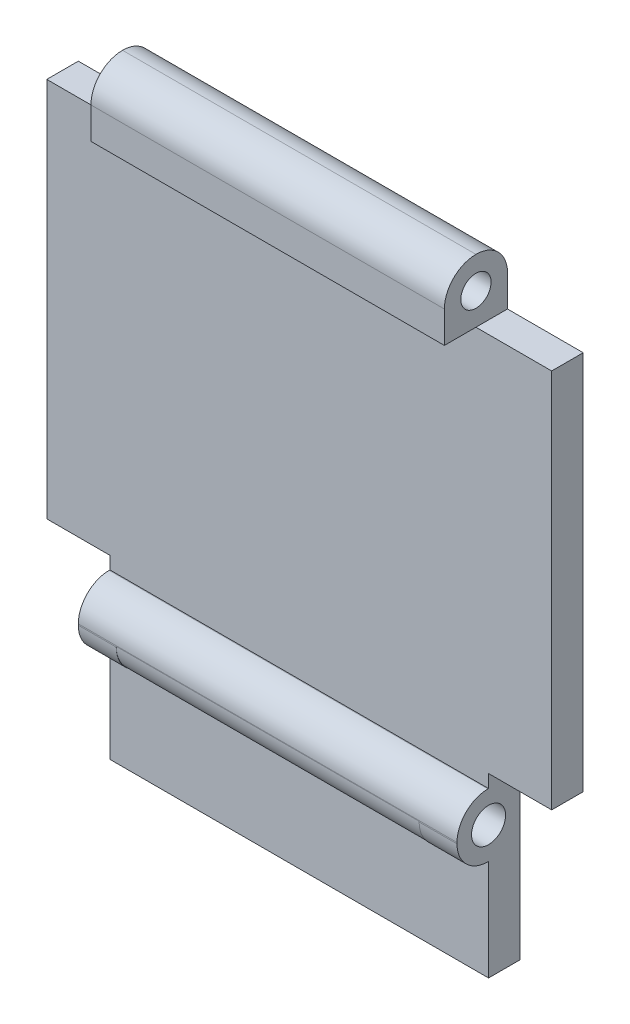
ISO-10303-21;
HEADER;
FILE_DESCRIPTION(('STEP AP214'),'2;1');
FILE_NAME('part.step','',(''),(''),'','','');
FILE_SCHEMA(('AUTOMOTIVE_DESIGN { 1 0 10303 214 1 1 1 1 }'));
ENDSEC;
DATA;
#1=APPLICATION_CONTEXT('core data for automotive mechanical design processes');
#2=APPLICATION_PROTOCOL_DEFINITION('international standard','automotive_design',2000,#1);
#3=PRODUCT_CONTEXT('',#1,'mechanical');
#4=PRODUCT('Part','Part','',(#3));
#5=PRODUCT_RELATED_PRODUCT_CATEGORY('part','',(#4));
#6=PRODUCT_DEFINITION_FORMATION('','',#4);
#7=PRODUCT_DEFINITION_CONTEXT('part definition',#1,'design');
#8=PRODUCT_DEFINITION('design','',#6,#7);
#9=PRODUCT_DEFINITION_SHAPE('','',#8);
#10=(LENGTH_UNIT() NAMED_UNIT(*) SI_UNIT(.MILLI.,.METRE.));
#11=(NAMED_UNIT(*) PLANE_ANGLE_UNIT() SI_UNIT($,.RADIAN.));
#12=(NAMED_UNIT(*) SI_UNIT($,.STERADIAN.) SOLID_ANGLE_UNIT());
#13=UNCERTAINTY_MEASURE_WITH_UNIT(LENGTH_MEASURE(1.E-05),#10,'distance_accuracy_value','');
#14=(GEOMETRIC_REPRESENTATION_CONTEXT(3) GLOBAL_UNCERTAINTY_ASSIGNED_CONTEXT((#13)) GLOBAL_UNIT_ASSIGNED_CONTEXT((#10,
#11,#12)) REPRESENTATION_CONTEXT('',''));
#15=CARTESIAN_POINT('',(0.,0.,0.));
#16=DIRECTION('',(0.,0.,1.));
#17=DIRECTION('',(1.,0.,0.));
#18=AXIS2_PLACEMENT_3D('',#15,#16,#17);
#19=CARTESIAN_POINT('',(12.,-10.5439596254959,2.5));
#20=DIRECTION('',(0.,1.,0.));
#21=DIRECTION('',(0.,0.,1.));
#22=AXIS2_PLACEMENT_3D('',#19,#20,#21);
#23=PLANE('',#22);
#24=DIRECTION('',(0.,0.,1.));
#25=VECTOR('',#24,1.);
#26=CARTESIAN_POINT('',(15.,-10.5439596254959,2.5));
#27=LINE('',#26,#25);
#28=CARTESIAN_POINT('',(15.,-10.5439596254959,0.));
#29=VERTEX_POINT('',#28);
#30=CARTESIAN_POINT('',(15.,-10.5439596254959,2.5));
#31=VERTEX_POINT('',#30);
#32=EDGE_CURVE('E276',#29,#31,#27,.T.);
#33=ORIENTED_EDGE('',*,*,#32,.F.);
#34=DIRECTION('',(-1.,0.,0.));
#35=VECTOR('',#34,1.);
#36=CARTESIAN_POINT('',(0.,-10.5439596254959,0.));
#37=LINE('',#36,#35);
#38=CARTESIAN_POINT('',(20.,-10.5439596254959,0.));
#39=VERTEX_POINT('',#38);
#40=EDGE_CURVE('E331',#39,#29,#37,.T.);
#41=ORIENTED_EDGE('',*,*,#40,.F.);
#42=DIRECTION('',(0.,0.,1.));
#43=VECTOR('',#42,1.);
#44=CARTESIAN_POINT('',(20.,-10.5439596254959,2.5));
#45=LINE('',#44,#43);
#46=CARTESIAN_POINT('',(20.,-10.5439596254959,2.5));
#47=VERTEX_POINT('',#46);
#48=EDGE_CURVE('E326',#39,#47,#45,.T.);
#49=ORIENTED_EDGE('',*,*,#48,.T.);
#50=DIRECTION('',(1.,0.,0.));
#51=VECTOR('',#50,1.);
#52=CARTESIAN_POINT('',(12.,-10.5439596254959,2.5));
#53=LINE('',#52,#51);
#54=EDGE_CURVE('E329',#31,#47,#53,.T.);
#55=ORIENTED_EDGE('',*,*,#54,.F.);
#56=EDGE_LOOP('',(#33,#41,#49,#55));
#57=FACE_BOUND('',#56,.T.);
#58=ADVANCED_FACE('F36',(#57),#23,.F.);
#59=CARTESIAN_POINT('',(0.,0.,2.5));
#60=DIRECTION('',(0.,0.,1.));
#61=DIRECTION('',(1.,0.,0.));
#62=AXIS2_PLACEMENT_3D('',#59,#60,#61);
#63=PLANE('',#62);
#64=DIRECTION('',(1.,0.,0.));
#65=VECTOR('',#64,1.);
#66=CARTESIAN_POINT('',(20.,-24.575,2.5));
#67=LINE('',#66,#65);
#68=CARTESIAN_POINT('',(-15.,-24.575,2.5));
#69=VERTEX_POINT('',#68);
#70=CARTESIAN_POINT('',(15.,-24.575,2.5));
#71=VERTEX_POINT('',#70);
#72=EDGE_CURVE('E235',#69,#71,#67,.T.);
#73=ORIENTED_EDGE('',*,*,#72,.T.);
#74=DIRECTION('',(0.,-1.,0.));
#75=VECTOR('',#74,1.);
#76=CARTESIAN_POINT('',(15.,-24.575,2.5));
#77=LINE('',#76,#75);
#78=CARTESIAN_POINT('',(15.,-16.575,2.5));
#79=VERTEX_POINT('',#78);
#80=EDGE_CURVE('E290',#79,#71,#77,.T.);
#81=ORIENTED_EDGE('',*,*,#80,.F.);
#82=DIRECTION('',(-1.,0.,0.));
#83=VECTOR('',#82,1.);
#84=CARTESIAN_POINT('',(15.,-16.575,2.5));
#85=LINE('',#84,#83);
#86=CARTESIAN_POINT('',(12.,-16.575,2.5));
#87=VERTEX_POINT('',#86);
#88=EDGE_CURVE('E295',#79,#87,#85,.T.);
#89=ORIENTED_EDGE('',*,*,#88,.T.);
#90=DIRECTION('',(1.,0.,0.));
#91=VECTOR('',#90,1.);
#92=CARTESIAN_POINT('',(0.,-16.575,2.5));
#93=LINE('',#92,#91);
#94=CARTESIAN_POINT('',(-12.,-16.575,2.5));
#95=VERTEX_POINT('',#94);
#96=EDGE_CURVE('E316',#95,#87,#93,.T.);
#97=ORIENTED_EDGE('',*,*,#96,.F.);
#98=DIRECTION('',(1.,0.,0.));
#99=VECTOR('',#98,1.);
#100=CARTESIAN_POINT('',(-15.,-16.575,2.5));
#101=LINE('',#100,#99);
#102=CARTESIAN_POINT('',(-15.,-16.575,2.5));
#103=VERTEX_POINT('',#102);
#104=EDGE_CURVE('E268',#103,#95,#101,.T.);
#105=ORIENTED_EDGE('',*,*,#104,.F.);
#106=DIRECTION('',(0.,1.,0.));
#107=VECTOR('',#106,1.);
#108=CARTESIAN_POINT('',(-15.,-24.575,2.5));
#109=LINE('',#108,#107);
#110=EDGE_CURVE('E238',#69,#103,#109,.T.);
#111=ORIENTED_EDGE('',*,*,#110,.F.);
#112=EDGE_LOOP('',(#73,#81,#89,#97,#105,#111));
#113=FACE_BOUND('',#112,.T.);
#114=ADVANCED_FACE('F460',(#113),#63,.T.);
#115=CARTESIAN_POINT('',(20.,-24.575,5.));
#116=DIRECTION('',(-1.,0.,0.));
#117=DIRECTION('',(0.,0.,1.));
#118=AXIS2_PLACEMENT_3D('',#115,#116,#117);
#119=PLANE('',#118);
#120=DIRECTION('',(0.,1.,0.));
#121=VECTOR('',#120,1.);
#122=CARTESIAN_POINT('',(20.,19.575,2.5));
#123=LINE('',#122,#121);
#124=CARTESIAN_POINT('',(20.,19.575,2.5));
#125=VERTEX_POINT('',#124);
#126=EDGE_CURVE('E350',#47,#125,#123,.T.);
#127=ORIENTED_EDGE('',*,*,#126,.F.);
#128=ORIENTED_EDGE('',*,*,#48,.F.);
#129=DIRECTION('',(0.,1.,0.));
#130=VECTOR('',#129,1.);
#131=CARTESIAN_POINT('',(20.,-24.575,0.));
#132=LINE('',#131,#130);
#133=CARTESIAN_POINT('',(20.,19.575,0.));
#134=VERTEX_POINT('',#133);
#135=EDGE_CURVE('E229',#39,#134,#132,.T.);
#136=ORIENTED_EDGE('',*,*,#135,.T.);
#137=DIRECTION('',(0.,0.,-1.));
#138=VECTOR('',#137,1.);
#139=CARTESIAN_POINT('',(20.,19.575,5.));
#140=LINE('',#139,#138);
#141=EDGE_CURVE('E379',#125,#134,#140,.T.);
#142=ORIENTED_EDGE('',*,*,#141,.F.);
#143=EDGE_LOOP('',(#127,#128,#136,#142));
#144=FACE_BOUND('',#143,.T.);
#145=ADVANCED_FACE('F542',(#144),#119,.F.);
#146=CARTESIAN_POINT('',(20.,-24.575,5.));
#147=DIRECTION('',(0.,1.,0.));
#148=DIRECTION('',(-1.,0.,0.));
#149=AXIS2_PLACEMENT_3D('',#146,#147,#148);
#150=PLANE('',#149);
#151=DIRECTION('',(1.,0.,0.));
#152=VECTOR('',#151,1.);
#153=CARTESIAN_POINT('',(20.,-24.575,0.));
#154=LINE('',#153,#152);
#155=CARTESIAN_POINT('',(-15.,-24.575,0.));
#156=VERTEX_POINT('',#155);
#157=CARTESIAN_POINT('',(15.,-24.575,0.));
#158=VERTEX_POINT('',#157);
#159=EDGE_CURVE('E218',#156,#158,#154,.T.);
#160=ORIENTED_EDGE('',*,*,#159,.T.);
#161=DIRECTION('',(0.,0.,-1.));
#162=VECTOR('',#161,1.);
#163=CARTESIAN_POINT('',(15.,-24.575,0.));
#164=LINE('',#163,#162);
#165=EDGE_CURVE('E293',#71,#158,#164,.T.);
#166=ORIENTED_EDGE('',*,*,#165,.F.);
#167=ORIENTED_EDGE('',*,*,#72,.F.);
#168=DIRECTION('',(0.,0.,1.));
#169=VECTOR('',#168,1.);
#170=CARTESIAN_POINT('',(-15.,-24.575,0.));
#171=LINE('',#170,#169);
#172=EDGE_CURVE('E233',#156,#69,#171,.T.);
#173=ORIENTED_EDGE('',*,*,#172,.F.);
#174=EDGE_LOOP('',(#160,#166,#167,#173));
#175=FACE_BOUND('',#174,.T.);
#176=ADVANCED_FACE('F234',(#175),#150,.F.);
#177=CARTESIAN_POINT('',(20.,19.575,5.));
#178=DIRECTION('',(0.,1.,0.));
#179=DIRECTION('',(0.,0.,1.));
#180=AXIS2_PLACEMENT_3D('',#177,#178,#179);
#181=PLANE('',#180);
#182=DIRECTION('',(0.,0.,-1.));
#183=VECTOR('',#182,1.);
#184=CARTESIAN_POINT('',(14.,19.575,5.));
#185=LINE('',#184,#183);
#186=CARTESIAN_POINT('',(14.,19.575,2.5));
#187=VERTEX_POINT('',#186);
#188=CARTESIAN_POINT('',(14.,19.575,0.));
#189=VERTEX_POINT('',#188);
#190=EDGE_CURVE('E387',#187,#189,#185,.T.);
#191=ORIENTED_EDGE('',*,*,#190,.F.);
#192=DIRECTION('',(-1.,0.,0.));
#193=VECTOR('',#192,1.);
#194=CARTESIAN_POINT('',(20.,19.575,2.5));
#195=LINE('',#194,#193);
#196=EDGE_CURVE('E342',#125,#187,#195,.T.);
#197=ORIENTED_EDGE('',*,*,#196,.F.);
#198=ORIENTED_EDGE('',*,*,#141,.T.);
#199=DIRECTION('',(1.,0.,0.));
#200=VECTOR('',#199,1.);
#201=CARTESIAN_POINT('',(20.,19.575,0.));
#202=LINE('',#201,#200);
#203=EDGE_CURVE('E380',#189,#134,#202,.T.);
#204=ORIENTED_EDGE('',*,*,#203,.F.);
#205=EDGE_LOOP('',(#191,#197,#198,#204));
#206=FACE_BOUND('',#205,.T.);
#207=ADVANCED_FACE('F538',(#206),#181,.T.);
#208=CARTESIAN_POINT('',(-20.,-24.575,5.));
#209=DIRECTION('',(1.,0.,0.));
#210=DIRECTION('',(0.,0.,-1.));
#211=AXIS2_PLACEMENT_3D('',#208,#209,#210);
#212=PLANE('',#211);
#213=DIRECTION('',(0.,-1.,0.));
#214=VECTOR('',#213,1.);
#215=CARTESIAN_POINT('',(-20.,-24.575,0.));
#216=LINE('',#215,#214);
#217=CARTESIAN_POINT('',(-20.,19.5799216405794,0.));
#218=VERTEX_POINT('',#217);
#219=CARTESIAN_POINT('',(-20.,-10.575,0.));
#220=VERTEX_POINT('',#219);
#221=EDGE_CURVE('E230',#218,#220,#216,.T.);
#222=ORIENTED_EDGE('',*,*,#221,.T.);
#223=DIRECTION('',(0.,0.,-1.));
#224=VECTOR('',#223,1.);
#225=CARTESIAN_POINT('',(-20.,-10.575,2.49999999999999));
#226=LINE('',#225,#224);
#227=CARTESIAN_POINT('',(-20.,-10.575,2.49999999999999));
#228=VERTEX_POINT('',#227);
#229=EDGE_CURVE('E319',#228,#220,#226,.T.);
#230=ORIENTED_EDGE('',*,*,#229,.F.);
#231=DIRECTION('',(0.,-1.,0.));
#232=VECTOR('',#231,1.);
#233=CARTESIAN_POINT('',(-19.9999995124092,19.575,2.5));
#234=LINE('',#233,#232);
#235=CARTESIAN_POINT('',(-20.,19.5799216405794,2.5));
#236=VERTEX_POINT('',#235);
#237=EDGE_CURVE('E345',#236,#228,#234,.T.);
#238=ORIENTED_EDGE('',*,*,#237,.F.);
#239=DIRECTION('',(0.,0.,-1.));
#240=VECTOR('',#239,1.);
#241=CARTESIAN_POINT('',(-20.,19.5799216405794,5.));
#242=LINE('',#241,#240);
#243=EDGE_CURVE('E374',#236,#218,#242,.T.);
#244=ORIENTED_EDGE('',*,*,#243,.T.);
#245=EDGE_LOOP('',(#222,#230,#238,#244));
#246=FACE_BOUND('',#245,.T.);
#247=ADVANCED_FACE('F501',(#246),#212,.F.);
#248=CARTESIAN_POINT('',(0.,0.,5.));
#249=DIRECTION('',(0.,0.,1.));
#250=DIRECTION('',(1.,0.,0.));
#251=AXIS2_PLACEMENT_3D('',#248,#249,#250);
#252=PLANE('',#251);
#253=DIRECTION('',(0.,1.,0.));
#254=VECTOR('',#253,1.);
#255=CARTESIAN_POINT('',(-14.,24.575,5.));
#256=LINE('',#255,#254);
#257=CARTESIAN_POINT('',(-14.,19.575,5.));
#258=VERTEX_POINT('',#257);
#259=CARTESIAN_POINT('',(-14.,22.075,5.));
#260=VERTEX_POINT('',#259);
#261=EDGE_CURVE('E362',#258,#260,#256,.T.);
#262=ORIENTED_EDGE('',*,*,#261,.F.);
#263=DIRECTION('',(-1.,0.,0.));
#264=VECTOR('',#263,1.);
#265=CARTESIAN_POINT('',(20.,19.575,5.));
#266=LINE('',#265,#264);
#267=CARTESIAN_POINT('',(14.,19.575,5.));
#268=VERTEX_POINT('',#267);
#269=EDGE_CURVE('E341',#268,#258,#266,.T.);
#270=ORIENTED_EDGE('',*,*,#269,.F.);
#271=DIRECTION('',(0.,-1.,0.));
#272=VECTOR('',#271,1.);
#273=CARTESIAN_POINT('',(14.,24.575,5.));
#274=LINE('',#273,#272);
#275=CARTESIAN_POINT('',(14.,22.075,5.));
#276=VERTEX_POINT('',#275);
#277=EDGE_CURVE('E376',#276,#268,#274,.T.);
#278=ORIENTED_EDGE('',*,*,#277,.F.);
#279=DIRECTION('',(-1.,0.,0.));
#280=VECTOR('',#279,1.);
#281=CARTESIAN_POINT('',(-14.,22.075,5.));
#282=LINE('',#281,#280);
#283=EDGE_CURVE('E393',#276,#260,#282,.T.);
#284=ORIENTED_EDGE('',*,*,#283,.T.);
#285=EDGE_LOOP('',(#262,#270,#278,#284));
#286=FACE_BOUND('',#285,.T.);
#287=ADVANCED_FACE('F528',(#286),#252,.T.);
#288=CARTESIAN_POINT('',(0.,0.,0.));
#289=DIRECTION('',(0.,0.,1.));
#290=DIRECTION('',(1.,0.,0.));
#291=AXIS2_PLACEMENT_3D('',#288,#289,#290);
#292=PLANE('',#291);
#293=DIRECTION('',(0.,-1.,0.));
#294=VECTOR('',#293,1.);
#295=CARTESIAN_POINT('',(-15.,-10.575,0.));
#296=LINE('',#295,#294);
#297=CARTESIAN_POINT('',(-15.,-10.575,0.));
#298=VERTEX_POINT('',#297);
#299=EDGE_CURVE('E222',#298,#156,#296,.T.);
#300=ORIENTED_EDGE('',*,*,#299,.F.);
#301=DIRECTION('',(-1.,0.,0.));
#302=VECTOR('',#301,1.);
#303=CARTESIAN_POINT('',(0.,-10.575,0.));
#304=LINE('',#303,#302);
#305=EDGE_CURVE('E324',#298,#220,#304,.T.);
#306=ORIENTED_EDGE('',*,*,#305,.T.);
#307=ORIENTED_EDGE('',*,*,#221,.F.);
#308=DIRECTION('',(1.,0.,0.));
#309=VECTOR('',#308,1.);
#310=CARTESIAN_POINT('',(-20.,19.5799216405794,0.));
#311=LINE('',#310,#309);
#312=CARTESIAN_POINT('',(-14.,19.5799216405794,0.));
#313=VERTEX_POINT('',#312);
#314=EDGE_CURVE('E367',#218,#313,#311,.T.);
#315=ORIENTED_EDGE('',*,*,#314,.T.);
#316=DIRECTION('',(0.,1.,0.));
#317=VECTOR('',#316,1.);
#318=CARTESIAN_POINT('',(-14.,24.575,0.));
#319=LINE('',#318,#317);
#320=CARTESIAN_POINT('',(-14.,22.075,0.));
#321=VERTEX_POINT('',#320);
#322=EDGE_CURVE('E366',#313,#321,#319,.T.);
#323=ORIENTED_EDGE('',*,*,#322,.T.);
#324=DIRECTION('',(-1.,0.,0.));
#325=VECTOR('',#324,1.);
#326=CARTESIAN_POINT('',(0.,22.075,0.));
#327=LINE('',#326,#325);
#328=CARTESIAN_POINT('',(14.,22.075,0.));
#329=VERTEX_POINT('',#328);
#330=EDGE_CURVE('E404',#321,#329,#327,.F.);
#331=ORIENTED_EDGE('',*,*,#330,.T.);
#332=DIRECTION('',(0.,-1.,0.));
#333=VECTOR('',#332,1.);
#334=CARTESIAN_POINT('',(14.,24.575,0.));
#335=LINE('',#334,#333);
#336=EDGE_CURVE('E361',#329,#189,#335,.T.);
#337=ORIENTED_EDGE('',*,*,#336,.T.);
#338=ORIENTED_EDGE('',*,*,#203,.T.);
#339=ORIENTED_EDGE('',*,*,#135,.F.);
#340=ORIENTED_EDGE('',*,*,#40,.T.);
#341=DIRECTION('',(0.,1.,0.));
#342=VECTOR('',#341,1.);
#343=CARTESIAN_POINT('',(15.,-10.5439596254959,0.));
#344=LINE('',#343,#342);
#345=EDGE_CURVE('E225',#158,#29,#344,.T.);
#346=ORIENTED_EDGE('',*,*,#345,.F.);
#347=ORIENTED_EDGE('',*,*,#159,.F.);
#348=EDGE_LOOP('',(#300,#306,#307,#315,#323,#331,#337,#338,#339,#340,#346,#347));
#349=FACE_BOUND('',#348,.T.);
#350=ADVANCED_FACE('F220',(#349),#292,.F.);
#351=CARTESIAN_POINT('',(14.,24.575,5.));
#352=DIRECTION('',(1.,0.,0.));
#353=DIRECTION('',(0.,1.,0.));
#354=AXIS2_PLACEMENT_3D('',#351,#352,#353);
#355=PLANE('',#354);
#356=CARTESIAN_POINT('',(14.,22.075,2.5));
#357=DIRECTION('',(1.,0.,0.));
#358=DIRECTION('',(0.,1.,0.));
#359=AXIS2_PLACEMENT_3D('',#356,#357,#358);
#360=CIRCLE('',#359,1.2);
#361=CARTESIAN_POINT('',(14.,23.275,2.5));
#362=VERTEX_POINT('',#361);
#363=EDGE_CURVE('E358',#362,#362,#360,.T.);
#364=ORIENTED_EDGE('',*,*,#363,.F.);
#365=EDGE_LOOP('',(#364));
#366=FACE_BOUND('',#365,.T.);
#367=CARTESIAN_POINT('',(14.,22.075,2.5));
#368=DIRECTION('',(1.,0.,0.));
#369=DIRECTION('',(0.,1.,0.));
#370=AXIS2_PLACEMENT_3D('',#367,#368,#369);
#371=CIRCLE('',#370,2.5);
#372=CARTESIAN_POINT('',(14.,24.575,2.5));
#373=VERTEX_POINT('',#372);
#374=EDGE_CURVE('E400',#329,#373,#371,.T.);
#375=ORIENTED_EDGE('',*,*,#374,.T.);
#376=CARTESIAN_POINT('',(14.,22.075,2.5));
#377=DIRECTION('',(1.,0.,0.));
#378=DIRECTION('',(0.,1.,0.));
#379=AXIS2_PLACEMENT_3D('',#376,#377,#378);
#380=CIRCLE('',#379,2.5);
#381=EDGE_CURVE('E402',#373,#276,#380,.T.);
#382=ORIENTED_EDGE('',*,*,#381,.T.);
#383=ORIENTED_EDGE('',*,*,#277,.T.);
#384=EDGE_CURVE('E370',#268,#187,#185,.T.);
#385=ORIENTED_EDGE('',*,*,#384,.T.);
#386=ORIENTED_EDGE('',*,*,#190,.T.);
#387=ORIENTED_EDGE('',*,*,#336,.F.);
#388=EDGE_LOOP('',(#375,#382,#383,#385,#386,#387));
#389=FACE_BOUND('',#388,.T.);
#390=ADVANCED_FACE('F524',(#366,#389),#355,.T.);
#391=CARTESIAN_POINT('',(-20.,19.5799216405794,5.));
#392=DIRECTION('',(0.,1.,0.));
#393=DIRECTION('',(0.,0.,1.));
#394=AXIS2_PLACEMENT_3D('',#391,#392,#393);
#395=PLANE('',#394);
#396=DIRECTION('',(-1.,0.,0.));
#397=VECTOR('',#396,1.);
#398=CARTESIAN_POINT('',(-20.,19.5799216405794,2.5));
#399=LINE('',#398,#397);
#400=CARTESIAN_POINT('',(-14.,19.5799216405794,2.5));
#401=VERTEX_POINT('',#400);
#402=EDGE_CURVE('E333',#401,#236,#399,.T.);
#403=ORIENTED_EDGE('',*,*,#402,.F.);
#404=DIRECTION('',(0.,0.,-1.));
#405=VECTOR('',#404,1.);
#406=CARTESIAN_POINT('',(-14.,19.5799216405794,5.));
#407=LINE('',#406,#405);
#408=EDGE_CURVE('E365',#401,#313,#407,.T.);
#409=ORIENTED_EDGE('',*,*,#408,.T.);
#410=ORIENTED_EDGE('',*,*,#314,.F.);
#411=ORIENTED_EDGE('',*,*,#243,.F.);
#412=EDGE_LOOP('',(#403,#409,#410,#411));
#413=FACE_BOUND('',#412,.T.);
#414=ADVANCED_FACE('F509',(#413),#395,.T.);
#415=CARTESIAN_POINT('',(-14.,24.575,5.));
#416=DIRECTION('',(-1.,0.,0.));
#417=DIRECTION('',(0.,-1.,0.));
#418=AXIS2_PLACEMENT_3D('',#415,#416,#417);
#419=PLANE('',#418);
#420=CARTESIAN_POINT('',(-14.,22.075,2.5));
#421=DIRECTION('',(-1.,0.,0.));
#422=DIRECTION('',(0.,0.,1.));
#423=AXIS2_PLACEMENT_3D('',#420,#421,#422);
#424=CIRCLE('',#423,1.2);
#425=CARTESIAN_POINT('',(-14.,22.075,3.7));
#426=VERTEX_POINT('',#425);
#427=EDGE_CURVE('E355',#426,#426,#424,.T.);
#428=ORIENTED_EDGE('',*,*,#427,.F.);
#429=EDGE_LOOP('',(#428));
#430=FACE_BOUND('',#429,.T.);
#431=ORIENTED_EDGE('',*,*,#261,.T.);
#432=CARTESIAN_POINT('',(-14.,22.075,2.5));
#433=DIRECTION('',(-1.,0.,0.));
#434=DIRECTION('',(0.,-1.,0.));
#435=AXIS2_PLACEMENT_3D('',#432,#433,#434);
#436=CIRCLE('',#435,2.5);
#437=CARTESIAN_POINT('',(-14.,24.575,2.5));
#438=VERTEX_POINT('',#437);
#439=EDGE_CURVE('E398',#260,#438,#436,.T.);
#440=ORIENTED_EDGE('',*,*,#439,.T.);
#441=CARTESIAN_POINT('',(-14.,22.075,2.5));
#442=DIRECTION('',(-1.,0.,0.));
#443=DIRECTION('',(0.,-1.,0.));
#444=AXIS2_PLACEMENT_3D('',#441,#442,#443);
#445=CIRCLE('',#444,2.5);
#446=EDGE_CURVE('E396',#438,#321,#445,.T.);
#447=ORIENTED_EDGE('',*,*,#446,.T.);
#448=ORIENTED_EDGE('',*,*,#322,.F.);
#449=ORIENTED_EDGE('',*,*,#408,.F.);
#450=DIRECTION('',(0.,1.,0.));
#451=VECTOR('',#450,1.);
#452=CARTESIAN_POINT('',(-14.,19.5699216405794,2.5));
#453=LINE('',#452,#451);
#454=CARTESIAN_POINT('',(-14.,19.575,2.5));
#455=VERTEX_POINT('',#454);
#456=EDGE_CURVE('E336',#455,#401,#453,.T.);
#457=ORIENTED_EDGE('',*,*,#456,.F.);
#458=DIRECTION('',(0.,0.,-1.));
#459=VECTOR('',#458,1.);
#460=CARTESIAN_POINT('',(-14.,19.575,2.49999999999998));
#461=LINE('',#460,#459);
#462=EDGE_CURVE('E338',#258,#455,#461,.T.);
#463=ORIENTED_EDGE('',*,*,#462,.F.);
#464=EDGE_LOOP('',(#431,#440,#447,#448,#449,#457,#463));
#465=FACE_BOUND('',#464,.T.);
#466=ADVANCED_FACE('F512',(#430,#465),#419,.T.);
#467=CARTESIAN_POINT('',(18.,22.075,2.5));
#468=DIRECTION('',(-1.,0.,0.));
#469=DIRECTION('',(0.,0.,1.));
#470=AXIS2_PLACEMENT_3D('',#467,#468,#469);
#471=CYLINDRICAL_SURFACE('',#470,1.2);
#472=ORIENTED_EDGE('',*,*,#363,.T.);
#473=EDGE_LOOP('',(#472));
#474=FACE_BOUND('',#473,.T.);
#475=ORIENTED_EDGE('',*,*,#427,.T.);
#476=EDGE_LOOP('',(#475));
#477=FACE_BOUND('',#476,.T.);
#478=ADVANCED_FACE('F582',(#474,#477),#471,.F.);
#479=CARTESIAN_POINT('',(20.,22.075,2.5));
#480=DIRECTION('',(-1.,0.,0.));
#481=DIRECTION('',(0.,-1.,0.));
#482=AXIS2_PLACEMENT_3D('',#479,#480,#481);
#483=CYLINDRICAL_SURFACE('',#482,2.5);
#484=DIRECTION('',(-1.,0.,0.));
#485=VECTOR('',#484,1.);
#486=CARTESIAN_POINT('',(20.,24.575,2.5));
#487=LINE('',#486,#485);
#488=EDGE_CURVE('E352',#373,#438,#487,.T.);
#489=ORIENTED_EDGE('',*,*,#488,.F.);
#490=ORIENTED_EDGE('',*,*,#374,.F.);
#491=ORIENTED_EDGE('',*,*,#330,.F.);
#492=ORIENTED_EDGE('',*,*,#446,.F.);
#493=EDGE_LOOP('',(#489,#490,#491,#492));
#494=FACE_BOUND('',#493,.T.);
#495=ADVANCED_FACE('F516',(#494),#483,.T.);
#496=CARTESIAN_POINT('',(0.,22.075,2.5));
#497=DIRECTION('',(1.,0.,0.));
#498=DIRECTION('',(0.,1.,0.));
#499=AXIS2_PLACEMENT_3D('',#496,#497,#498);
#500=CYLINDRICAL_SURFACE('',#499,2.5);
#501=ORIENTED_EDGE('',*,*,#381,.F.);
#502=ORIENTED_EDGE('',*,*,#488,.T.);
#503=ORIENTED_EDGE('',*,*,#439,.F.);
#504=ORIENTED_EDGE('',*,*,#283,.F.);
#505=EDGE_LOOP('',(#501,#502,#503,#504));
#506=FACE_BOUND('',#505,.T.);
#507=ADVANCED_FACE('F520',(#506),#500,.T.);
#508=CARTESIAN_POINT('',(20.,19.575,2.5));
#509=DIRECTION('',(0.,1.,0.));
#510=DIRECTION('',(-1.,0.,0.));
#511=AXIS2_PLACEMENT_3D('',#508,#509,#510);
#512=PLANE('',#511);
#513=ORIENTED_EDGE('',*,*,#269,.T.);
#514=ORIENTED_EDGE('',*,*,#462,.T.);
#515=EDGE_CURVE('E346',#187,#455,#195,.T.);
#516=ORIENTED_EDGE('',*,*,#515,.F.);
#517=ORIENTED_EDGE('',*,*,#384,.F.);
#518=EDGE_LOOP('',(#513,#514,#516,#517));
#519=FACE_BOUND('',#518,.T.);
#520=ADVANCED_FACE('F531',(#519),#512,.F.);
#521=DIRECTION('',(-1.,0.,0.));
#522=VECTOR('',#521,1.);
#523=CARTESIAN_POINT('',(-12.,-10.575,2.49999999999999));
#524=LINE('',#523,#522);
#525=CARTESIAN_POINT('',(-15.,-10.575,2.49999999999999));
#526=VERTEX_POINT('',#525);
#527=EDGE_CURVE('E322',#526,#228,#524,.T.);
#528=ORIENTED_EDGE('',*,*,#527,.F.);
#529=DIRECTION('',(0.,1.,0.));
#530=VECTOR('',#529,1.);
#531=CARTESIAN_POINT('',(-15.,-11.5775410566773,2.5));
#532=LINE('',#531,#530);
#533=CARTESIAN_POINT('',(-15.,-11.5775410566773,2.5));
#534=VERTEX_POINT('',#533);
#535=EDGE_CURVE('E259',#534,#526,#532,.T.);
#536=ORIENTED_EDGE('',*,*,#535,.F.);
#537=DIRECTION('',(1.,0.,0.));
#538=VECTOR('',#537,1.);
#539=CARTESIAN_POINT('',(-15.,-11.5775410566773,2.5));
#540=LINE('',#539,#538);
#541=CARTESIAN_POINT('',(-12.,-11.5775410566773,2.5));
#542=VERTEX_POINT('',#541);
#543=EDGE_CURVE('E262',#534,#542,#540,.T.);
#544=ORIENTED_EDGE('',*,*,#543,.T.);
#545=DIRECTION('',(-1.,0.,0.));
#546=VECTOR('',#545,1.);
#547=CARTESIAN_POINT('',(0.,-11.5775410566773,2.5));
#548=LINE('',#547,#546);
#549=CARTESIAN_POINT('',(12.,-11.5775410566773,2.5));
#550=VERTEX_POINT('',#549);
#551=EDGE_CURVE('E311',#550,#542,#548,.T.);
#552=ORIENTED_EDGE('',*,*,#551,.F.);
#553=DIRECTION('',(-1.,0.,0.));
#554=VECTOR('',#553,1.);
#555=CARTESIAN_POINT('',(15.,-11.5775410566773,2.5));
#556=LINE('',#555,#554);
#557=CARTESIAN_POINT('',(15.,-11.5775410566773,2.5));
#558=VERTEX_POINT('',#557);
#559=EDGE_CURVE('E304',#558,#550,#556,.T.);
#560=ORIENTED_EDGE('',*,*,#559,.F.);
#561=DIRECTION('',(0.,-1.,0.));
#562=VECTOR('',#561,1.);
#563=CARTESIAN_POINT('',(15.,-11.5775410566773,2.5));
#564=LINE('',#563,#562);
#565=EDGE_CURVE('E280',#31,#558,#564,.T.);
#566=ORIENTED_EDGE('',*,*,#565,.F.);
#567=ORIENTED_EDGE('',*,*,#54,.T.);
#568=ORIENTED_EDGE('',*,*,#126,.T.);
#569=ORIENTED_EDGE('',*,*,#196,.T.);
#570=ORIENTED_EDGE('',*,*,#515,.T.);
#571=ORIENTED_EDGE('',*,*,#456,.T.);
#572=ORIENTED_EDGE('',*,*,#402,.T.);
#573=ORIENTED_EDGE('',*,*,#237,.T.);
#574=EDGE_LOOP('',(#528,#536,#544,#552,#560,#566,#567,#568,#569,#570,#571,#572,#573));
#575=FACE_BOUND('',#574,.T.);
#576=ADVANCED_FACE('F496',(#575),#63,.T.);
#577=CARTESIAN_POINT('',(-12.,-10.575,2.49999999999999));
#578=DIRECTION('',(0.,1.,0.));
#579=DIRECTION('',(0.,0.,1.));
#580=AXIS2_PLACEMENT_3D('',#577,#578,#579);
#581=PLANE('',#580);
#582=ORIENTED_EDGE('',*,*,#305,.F.);
#583=DIRECTION('',(0.,0.,-1.));
#584=VECTOR('',#583,1.);
#585=CARTESIAN_POINT('',(-15.,-10.575,2.49999999999999));
#586=LINE('',#585,#584);
#587=EDGE_CURVE('E244',#526,#298,#586,.T.);
#588=ORIENTED_EDGE('',*,*,#587,.F.);
#589=ORIENTED_EDGE('',*,*,#527,.T.);
#590=ORIENTED_EDGE('',*,*,#229,.T.);
#591=EDGE_LOOP('',(#582,#588,#589,#590));
#592=FACE_BOUND('',#591,.T.);
#593=ADVANCED_FACE('F499',(#592),#581,.F.);
#594=CARTESIAN_POINT('',(-12.,-16.575,5.));
#595=DIRECTION('',(0.,0.,1.));
#596=DIRECTION('',(1.,0.,0.));
#597=AXIS2_PLACEMENT_3D('',#594,#595,#596);
#598=PLANE('',#597);
#599=DIRECTION('',(0.,1.,0.));
#600=VECTOR('',#599,1.);
#601=CARTESIAN_POINT('',(-15.,-16.575,5.));
#602=LINE('',#601,#600);
#603=CARTESIAN_POINT('',(-15.,-14.125,5.));
#604=VERTEX_POINT('',#603);
#605=CARTESIAN_POINT('',(-15.,-14.0275122964753,5.));
#606=VERTEX_POINT('',#605);
#607=EDGE_CURVE('E255',#604,#606,#602,.T.);
#608=ORIENTED_EDGE('',*,*,#607,.F.);
#609=DIRECTION('',(1.,0.,0.));
#610=VECTOR('',#609,1.);
#611=CARTESIAN_POINT('',(-12.,-14.125,5.));
#612=LINE('',#611,#610);
#613=CARTESIAN_POINT('',(-12.,-14.125,5.));
#614=VERTEX_POINT('',#613);
#615=EDGE_CURVE('E443',#604,#614,#612,.T.);
#616=ORIENTED_EDGE('',*,*,#615,.T.);
#617=DIRECTION('',(0.,1.,0.));
#618=VECTOR('',#617,1.);
#619=CARTESIAN_POINT('',(-12.,-16.575,5.));
#620=LINE('',#619,#618);
#621=CARTESIAN_POINT('',(-12.,-14.075,5.));
#622=VERTEX_POINT('',#621);
#623=EDGE_CURVE('E247',#614,#622,#620,.T.);
#624=ORIENTED_EDGE('',*,*,#623,.T.);
#625=DIRECTION('',(1.,0.,0.));
#626=VECTOR('',#625,1.);
#627=CARTESIAN_POINT('',(-12.,-14.075,5.));
#628=LINE('',#627,#626);
#629=CARTESIAN_POINT('',(12.,-14.075,5.));
#630=VERTEX_POINT('',#629);
#631=EDGE_CURVE('E411',#622,#630,#628,.T.);
#632=ORIENTED_EDGE('',*,*,#631,.T.);
#633=DIRECTION('',(0.,-1.,0.));
#634=VECTOR('',#633,1.);
#635=CARTESIAN_POINT('',(12.,-16.575,5.));
#636=LINE('',#635,#634);
#637=CARTESIAN_POINT('',(12.,-14.125,5.));
#638=VERTEX_POINT('',#637);
#639=EDGE_CURVE('E298',#630,#638,#636,.T.);
#640=ORIENTED_EDGE('',*,*,#639,.T.);
#641=DIRECTION('',(-1.,0.,0.));
#642=VECTOR('',#641,1.);
#643=CARTESIAN_POINT('',(15.,-14.125,5.));
#644=LINE('',#643,#642);
#645=CARTESIAN_POINT('',(15.,-14.125,5.));
#646=VERTEX_POINT('',#645);
#647=EDGE_CURVE('E417',#638,#646,#644,.F.);
#648=ORIENTED_EDGE('',*,*,#647,.T.);
#649=DIRECTION('',(0.,-1.,0.));
#650=VECTOR('',#649,1.);
#651=CARTESIAN_POINT('',(15.,-16.575,5.));
#652=LINE('',#651,#650);
#653=CARTESIAN_POINT('',(15.,-14.0275122964753,5.));
#654=VERTEX_POINT('',#653);
#655=EDGE_CURVE('E285',#654,#646,#652,.T.);
#656=ORIENTED_EDGE('',*,*,#655,.F.);
#657=DIRECTION('',(-1.,0.,0.));
#658=VECTOR('',#657,1.);
#659=CARTESIAN_POINT('',(12.,-14.0275122964753,5.));
#660=LINE('',#659,#658);
#661=EDGE_CURVE('E419',#654,#606,#660,.T.);
#662=ORIENTED_EDGE('',*,*,#661,.T.);
#663=EDGE_LOOP('',(#608,#616,#624,#632,#640,#648,#656,#662));
#664=FACE_BOUND('',#663,.T.);
#665=ADVANCED_FACE('F449',(#664),#598,.T.);
#666=CARTESIAN_POINT('',(-12.,-11.5775410566773,0.));
#667=DIRECTION('',(0.,1.,0.));
#668=DIRECTION('',(0.,0.,1.));
#669=AXIS2_PLACEMENT_3D('',#666,#667,#668);
#670=PLANE('',#669);
#671=DIRECTION('',(0.,0.,1.));
#672=VECTOR('',#671,1.);
#673=CARTESIAN_POINT('',(-12.,-11.5775410566773,0.));
#674=LINE('',#673,#672);
#675=CARTESIAN_POINT('',(-12.,-11.5775410566773,2.56187114832778));
#676=VERTEX_POINT('',#675);
#677=EDGE_CURVE('E308',#542,#676,#674,.T.);
#678=ORIENTED_EDGE('',*,*,#677,.T.);
#679=DIRECTION('',(1.,0.,0.));
#680=VECTOR('',#679,1.);
#681=CARTESIAN_POINT('',(-12.,-11.5775410566773,2.56187114832778));
#682=LINE('',#681,#680);
#683=CARTESIAN_POINT('',(12.,-11.5775410566773,2.5618711483276));
#684=VERTEX_POINT('',#683);
#685=EDGE_CURVE('E428',#676,#684,#682,.T.);
#686=ORIENTED_EDGE('',*,*,#685,.T.);
#687=DIRECTION('',(0.,0.,1.));
#688=VECTOR('',#687,1.);
#689=CARTESIAN_POINT('',(12.,-11.5775410566773,0.));
#690=LINE('',#689,#688);
#691=EDGE_CURVE('E307',#550,#684,#690,.T.);
#692=ORIENTED_EDGE('',*,*,#691,.F.);
#693=ORIENTED_EDGE('',*,*,#551,.T.);
#694=EDGE_LOOP('',(#678,#686,#692,#693));
#695=FACE_BOUND('',#694,.T.);
#696=ADVANCED_FACE('F556',(#695),#670,.T.);
#697=CARTESIAN_POINT('',(12.,-14.0762705283387,2.5));
#698=DIRECTION('',(-1.,0.,0.));
#699=DIRECTION('',(0.,0.,1.));
#700=AXIS2_PLACEMENT_3D('',#697,#698,#699);
#701=CYLINDRICAL_SURFACE('',#700,1.35);
#702=CARTESIAN_POINT('',(15.,-14.0762705283387,2.5));
#703=DIRECTION('',(1.,0.,0.));
#704=DIRECTION('',(0.,0.,-1.));
#705=AXIS2_PLACEMENT_3D('',#702,#703,#704);
#706=CIRCLE('',#705,1.35);
#707=CARTESIAN_POINT('',(15.,-14.0762705283387,1.15));
#708=VERTEX_POINT('',#707);
#709=EDGE_CURVE('E271',#708,#708,#706,.T.);
#710=ORIENTED_EDGE('',*,*,#709,.T.);
#711=EDGE_LOOP('',(#710));
#712=FACE_BOUND('',#711,.T.);
#713=CARTESIAN_POINT('',(-15.,-14.0762705283387,2.5));
#714=DIRECTION('',(-1.,0.,0.));
#715=DIRECTION('',(0.,0.,1.));
#716=AXIS2_PLACEMENT_3D('',#713,#714,#715);
#717=CIRCLE('',#716,1.35);
#718=CARTESIAN_POINT('',(-15.,-14.0762705283387,3.85));
#719=VERTEX_POINT('',#718);
#720=EDGE_CURVE('E250',#719,#719,#717,.T.);
#721=ORIENTED_EDGE('',*,*,#720,.T.);
#722=EDGE_LOOP('',(#721));
#723=FACE_BOUND('',#722,.T.);
#724=ADVANCED_FACE('F612',(#712,#723),#701,.F.);
#725=CARTESIAN_POINT('',(-12.,-14.075,2.5));
#726=DIRECTION('',(1.,0.,0.));
#727=DIRECTION('',(0.,0.,-1.));
#728=AXIS2_PLACEMENT_3D('',#725,#726,#727);
#729=CYLINDRICAL_SURFACE('',#728,2.5);
#730=CARTESIAN_POINT('',(-12.,-14.075,2.5));
#731=DIRECTION('',(-1.,0.,0.));
#732=DIRECTION('',(0.,0.,1.));
#733=AXIS2_PLACEMENT_3D('',#730,#731,#732);
#734=CIRCLE('',#733,2.5);
#735=EDGE_CURVE('E414',#95,#622,#734,.T.);
#736=ORIENTED_EDGE('',*,*,#735,.F.);
#737=ORIENTED_EDGE('',*,*,#96,.T.);
#738=CARTESIAN_POINT('',(12.,-14.075,2.5));
#739=DIRECTION('',(-1.,0.,0.));
#740=DIRECTION('',(0.,0.,1.));
#741=AXIS2_PLACEMENT_3D('',#738,#739,#740);
#742=CIRCLE('',#741,2.5);
#743=EDGE_CURVE('E406',#630,#87,#742,.F.);
#744=ORIENTED_EDGE('',*,*,#743,.F.);
#745=ORIENTED_EDGE('',*,*,#631,.F.);
#746=EDGE_LOOP('',(#736,#737,#744,#745));
#747=FACE_BOUND('',#746,.T.);
#748=ADVANCED_FACE('F456',(#747),#729,.T.);
#749=CARTESIAN_POINT('',(12.,0.,0.));
#750=DIRECTION('',(-1.,0.,0.));
#751=DIRECTION('',(0.,0.,1.));
#752=AXIS2_PLACEMENT_3D('',#749,#750,#751);
#753=PLANE('',#752);
#754=ORIENTED_EDGE('',*,*,#691,.T.);
#755=CARTESIAN_POINT('',(12.,-14.0275122964753,2.55));
#756=DIRECTION('',(-1.,0.,0.));
#757=DIRECTION('',(0.,0.,1.));
#758=AXIS2_PLACEMENT_3D('',#755,#756,#757);
#759=CIRCLE('',#758,2.45);
#760=CARTESIAN_POINT('',(12.,-11.5775127136208,2.54857031021154));
#761=VERTEX_POINT('',#760);
#762=EDGE_CURVE('E430',#684,#761,#759,.T.);
#763=ORIENTED_EDGE('',*,*,#762,.T.);
#764=DIRECTION('',(0.,0.000583546852430433,0.999999829736521));
#765=VECTOR('',#764,1.);
#766=CARTESIAN_POINT('',(12.,-11.5760821892978,5.));
#767=LINE('',#766,#765);
#768=EDGE_CURVE('E274',#550,#761,#767,.T.);
#769=ORIENTED_EDGE('',*,*,#768,.F.);
#770=EDGE_LOOP('',(#754,#763,#769));
#771=FACE_BOUND('',#770,.T.);
#772=ADVANCED_FACE('F554',(#771),#753,.T.);
#773=CARTESIAN_POINT('',(15.,0.,0.));
#774=DIRECTION('',(-1.,0.,0.));
#775=DIRECTION('',(0.,0.,1.));
#776=AXIS2_PLACEMENT_3D('',#773,#774,#775);
#777=PLANE('',#776);
#778=DIRECTION('',(0.,0.000583546852430433,0.999999829736521));
#779=VECTOR('',#778,1.);
#780=CARTESIAN_POINT('',(15.,-11.5760821892978,5.));
#781=LINE('',#780,#779);
#782=CARTESIAN_POINT('',(15.,-11.5775127136208,2.54857031021154));
#783=VERTEX_POINT('',#782);
#784=EDGE_CURVE('E282',#558,#783,#781,.T.);
#785=ORIENTED_EDGE('',*,*,#784,.T.);
#786=CARTESIAN_POINT('',(15.,-14.0275122964753,2.55));
#787=DIRECTION('',(-1.,0.,0.));
#788=DIRECTION('',(0.,0.,1.));
#789=AXIS2_PLACEMENT_3D('',#786,#787,#788);
#790=CIRCLE('',#789,2.45);
#791=EDGE_CURVE('E436',#783,#654,#790,.F.);
#792=ORIENTED_EDGE('',*,*,#791,.T.);
#793=ORIENTED_EDGE('',*,*,#655,.T.);
#794=CARTESIAN_POINT('',(15.,-14.125,2.55));
#795=DIRECTION('',(-1.,0.,0.));
#796=DIRECTION('',(0.,0.,1.));
#797=AXIS2_PLACEMENT_3D('',#794,#795,#796);
#798=CIRCLE('',#797,2.45);
#799=CARTESIAN_POINT('',(15.,-16.575,2.55));
#800=VERTEX_POINT('',#799);
#801=EDGE_CURVE('E434',#646,#800,#798,.F.);
#802=ORIENTED_EDGE('',*,*,#801,.T.);
#803=DIRECTION('',(0.,0.,-1.));
#804=VECTOR('',#803,1.);
#805=CARTESIAN_POINT('',(15.,-16.575,2.5));
#806=LINE('',#805,#804);
#807=EDGE_CURVE('E288',#800,#79,#806,.T.);
#808=ORIENTED_EDGE('',*,*,#807,.T.);
#809=ORIENTED_EDGE('',*,*,#80,.T.);
#810=ORIENTED_EDGE('',*,*,#165,.T.);
#811=ORIENTED_EDGE('',*,*,#345,.T.);
#812=ORIENTED_EDGE('',*,*,#32,.T.);
#813=ORIENTED_EDGE('',*,*,#565,.T.);
#814=EDGE_LOOP('',(#785,#792,#793,#802,#808,#809,#810,#811,#812,#813));
#815=FACE_BOUND('',#814,.T.);
#816=ORIENTED_EDGE('',*,*,#709,.F.);
#817=EDGE_LOOP('',(#816));
#818=FACE_BOUND('',#817,.T.);
#819=ADVANCED_FACE('F477',(#815,#818),#777,.F.);
#820=DIRECTION('',(0.,0.,-1.));
#821=VECTOR('',#820,1.);
#822=CARTESIAN_POINT('',(12.,-16.575,2.5));
#823=LINE('',#822,#821);
#824=CARTESIAN_POINT('',(12.,-16.575,2.55));
#825=VERTEX_POINT('',#824);
#826=EDGE_CURVE('E277',#825,#87,#823,.T.);
#827=ORIENTED_EDGE('',*,*,#826,.F.);
#828=CARTESIAN_POINT('',(12.,-14.125,2.55));
#829=DIRECTION('',(-1.,0.,0.));
#830=DIRECTION('',(0.,0.,1.));
#831=AXIS2_PLACEMENT_3D('',#828,#829,#830);
#832=CIRCLE('',#831,2.45);
#833=EDGE_CURVE('E441',#825,#638,#832,.T.);
#834=ORIENTED_EDGE('',*,*,#833,.T.);
#835=ORIENTED_EDGE('',*,*,#639,.F.);
#836=ORIENTED_EDGE('',*,*,#743,.T.);
#837=EDGE_LOOP('',(#827,#834,#835,#836));
#838=FACE_BOUND('',#837,.T.);
#839=ADVANCED_FACE('F469',(#838),#753,.T.);
#840=CARTESIAN_POINT('',(15.,-11.5760821892978,5.));
#841=DIRECTION('',(0.,-0.999999829736521,0.000583546852430433));
#842=DIRECTION('',(0.,-0.000583546852430433,-0.999999829736521));
#843=AXIS2_PLACEMENT_3D('',#840,#841,#842);
#844=PLANE('',#843);
#845=ORIENTED_EDGE('',*,*,#768,.T.);
#846=DIRECTION('',(-1.,0.,0.));
#847=VECTOR('',#846,1.);
#848=CARTESIAN_POINT('',(15.,-11.5775127136208,2.54857031021154));
#849=LINE('',#848,#847);
#850=EDGE_CURVE('E432',#761,#783,#849,.F.);
#851=ORIENTED_EDGE('',*,*,#850,.T.);
#852=ORIENTED_EDGE('',*,*,#784,.F.);
#853=ORIENTED_EDGE('',*,*,#559,.T.);
#854=EDGE_LOOP('',(#845,#851,#852,#853));
#855=FACE_BOUND('',#854,.T.);
#856=ADVANCED_FACE('F550',(#855),#844,.F.);
#857=CARTESIAN_POINT('',(15.,-16.575,2.5));
#858=DIRECTION('',(0.,1.,0.));
#859=DIRECTION('',(0.,0.,1.));
#860=AXIS2_PLACEMENT_3D('',#857,#858,#859);
#861=PLANE('',#860);
#862=ORIENTED_EDGE('',*,*,#807,.F.);
#863=DIRECTION('',(-1.,0.,0.));
#864=VECTOR('',#863,1.);
#865=CARTESIAN_POINT('',(12.,-16.575,2.55));
#866=LINE('',#865,#864);
#867=EDGE_CURVE('E438',#800,#825,#866,.T.);
#868=ORIENTED_EDGE('',*,*,#867,.T.);
#869=ORIENTED_EDGE('',*,*,#826,.T.);
#870=ORIENTED_EDGE('',*,*,#88,.F.);
#871=EDGE_LOOP('',(#862,#868,#869,#870));
#872=FACE_BOUND('',#871,.T.);
#873=ADVANCED_FACE('F465',(#872),#861,.F.);
#874=CARTESIAN_POINT('',(-12.,0.,0.));
#875=DIRECTION('',(-1.,0.,0.));
#876=DIRECTION('',(0.,0.,1.));
#877=AXIS2_PLACEMENT_3D('',#874,#875,#876);
#878=PLANE('',#877);
#879=DIRECTION('',(0.,-0.000212810770987411,-0.999999977355788));
#880=VECTOR('',#879,1.);
#881=CARTESIAN_POINT('',(-12.,-11.5770090297378,5.));
#882=LINE('',#881,#880);
#883=CARTESIAN_POINT('',(-12.,-11.577528518789,2.55891566453226));
#884=VERTEX_POINT('',#883);
#885=EDGE_CURVE('E245',#884,#542,#882,.T.);
#886=ORIENTED_EDGE('',*,*,#885,.F.);
#887=CARTESIAN_POINT('',(-12.,-14.0275122964753,2.55));
#888=DIRECTION('',(-1.,0.,0.));
#889=DIRECTION('',(0.,0.,1.));
#890=AXIS2_PLACEMENT_3D('',#887,#888,#889);
#891=CIRCLE('',#890,2.45);
#892=EDGE_CURVE('E426',#884,#676,#891,.F.);
#893=ORIENTED_EDGE('',*,*,#892,.T.);
#894=ORIENTED_EDGE('',*,*,#677,.F.);
#895=EDGE_LOOP('',(#886,#893,#894));
#896=FACE_BOUND('',#895,.T.);
#897=ADVANCED_FACE('F559',(#896),#878,.F.);
#898=CARTESIAN_POINT('',(-15.,0.,0.));
#899=DIRECTION('',(-1.,0.,0.));
#900=DIRECTION('',(0.,0.,1.));
#901=AXIS2_PLACEMENT_3D('',#898,#899,#900);
#902=PLANE('',#901);
#903=DIRECTION('',(0.,0.,1.));
#904=VECTOR('',#903,1.);
#905=CARTESIAN_POINT('',(-15.,-16.575,2.5));
#906=LINE('',#905,#904);
#907=CARTESIAN_POINT('',(-15.,-16.575,2.55));
#908=VERTEX_POINT('',#907);
#909=EDGE_CURVE('E253',#103,#908,#906,.T.);
#910=ORIENTED_EDGE('',*,*,#909,.T.);
#911=CARTESIAN_POINT('',(-15.,-14.125,2.55));
#912=DIRECTION('',(-1.,0.,0.));
#913=DIRECTION('',(0.,0.,1.));
#914=AXIS2_PLACEMENT_3D('',#911,#912,#913);
#915=CIRCLE('',#914,2.45);
#916=EDGE_CURVE('E12',#908,#604,#915,.T.);
#917=ORIENTED_EDGE('',*,*,#916,.T.);
#918=ORIENTED_EDGE('',*,*,#607,.T.);
#919=CARTESIAN_POINT('',(-15.,-14.0275122964753,2.55));
#920=DIRECTION('',(-1.,0.,0.));
#921=DIRECTION('',(0.,0.,1.));
#922=AXIS2_PLACEMENT_3D('',#919,#920,#921);
#923=CIRCLE('',#922,2.45);
#924=CARTESIAN_POINT('',(-15.,-11.577528518789,2.5589156645324));
#925=VERTEX_POINT('',#924);
#926=EDGE_CURVE('E422',#606,#925,#923,.T.);
#927=ORIENTED_EDGE('',*,*,#926,.T.);
#928=DIRECTION('',(0.,-0.000212810770987411,-0.999999977355788));
#929=VECTOR('',#928,1.);
#930=CARTESIAN_POINT('',(-15.,-11.5770090297378,5.));
#931=LINE('',#930,#929);
#932=EDGE_CURVE('E257',#925,#534,#931,.T.);
#933=ORIENTED_EDGE('',*,*,#932,.T.);
#934=ORIENTED_EDGE('',*,*,#535,.T.);
#935=ORIENTED_EDGE('',*,*,#587,.T.);
#936=ORIENTED_EDGE('',*,*,#299,.T.);
#937=ORIENTED_EDGE('',*,*,#172,.T.);
#938=ORIENTED_EDGE('',*,*,#110,.T.);
#939=EDGE_LOOP('',(#910,#917,#918,#927,#933,#934,#935,#936,#937,#938));
#940=FACE_BOUND('',#939,.T.);
#941=ORIENTED_EDGE('',*,*,#720,.F.);
#942=EDGE_LOOP('',(#941));
#943=FACE_BOUND('',#942,.T.);
#944=ADVANCED_FACE('F241',(#940,#943),#902,.T.);
#945=ORIENTED_EDGE('',*,*,#623,.F.);
#946=CARTESIAN_POINT('',(-12.,-14.125,2.55));
#947=DIRECTION('',(-1.,0.,0.));
#948=DIRECTION('',(0.,0.,1.));
#949=AXIS2_PLACEMENT_3D('',#946,#947,#948);
#950=CIRCLE('',#949,2.45);
#951=CARTESIAN_POINT('',(-12.,-16.575,2.55));
#952=VERTEX_POINT('',#951);
#953=EDGE_CURVE('E58',#614,#952,#950,.F.);
#954=ORIENTED_EDGE('',*,*,#953,.T.);
#955=DIRECTION('',(0.,0.,1.));
#956=VECTOR('',#955,1.);
#957=CARTESIAN_POINT('',(-12.,-16.575,2.5));
#958=LINE('',#957,#956);
#959=EDGE_CURVE('E263',#95,#952,#958,.T.);
#960=ORIENTED_EDGE('',*,*,#959,.F.);
#961=ORIENTED_EDGE('',*,*,#735,.T.);
#962=EDGE_LOOP('',(#945,#954,#960,#961));
#963=FACE_BOUND('',#962,.T.);
#964=ADVANCED_FACE('F453',(#963),#878,.F.);
#965=CARTESIAN_POINT('',(-15.,-16.575,2.5));
#966=DIRECTION('',(0.,1.,0.));
#967=DIRECTION('',(0.,0.,1.));
#968=AXIS2_PLACEMENT_3D('',#965,#966,#967);
#969=PLANE('',#968);
#970=ORIENTED_EDGE('',*,*,#959,.T.);
#971=DIRECTION('',(1.,0.,0.));
#972=VECTOR('',#971,1.);
#973=CARTESIAN_POINT('',(-15.,-16.575,2.55));
#974=LINE('',#973,#972);
#975=EDGE_CURVE('E44',#952,#908,#974,.F.);
#976=ORIENTED_EDGE('',*,*,#975,.T.);
#977=ORIENTED_EDGE('',*,*,#909,.F.);
#978=ORIENTED_EDGE('',*,*,#104,.T.);
#979=EDGE_LOOP('',(#970,#976,#977,#978));
#980=FACE_BOUND('',#979,.T.);
#981=ADVANCED_FACE('F458',(#980),#969,.F.);
#982=CARTESIAN_POINT('',(-15.,-11.5770090297378,5.));
#983=DIRECTION('',(0.,-0.999999977355788,0.000212810770987411));
#984=DIRECTION('',(0.,-0.000212810770987411,-0.999999977355788));
#985=AXIS2_PLACEMENT_3D('',#982,#983,#984);
#986=PLANE('',#985);
#987=ORIENTED_EDGE('',*,*,#932,.F.);
#988=DIRECTION('',(1.,0.,0.));
#989=VECTOR('',#988,1.);
#990=CARTESIAN_POINT('',(-15.,-11.577528518789,2.55891566453239));
#991=LINE('',#990,#989);
#992=EDGE_CURVE('E424',#925,#884,#991,.T.);
#993=ORIENTED_EDGE('',*,*,#992,.T.);
#994=ORIENTED_EDGE('',*,*,#885,.T.);
#995=ORIENTED_EDGE('',*,*,#543,.F.);
#996=EDGE_LOOP('',(#987,#993,#994,#995));
#997=FACE_BOUND('',#996,.T.);
#998=ADVANCED_FACE('F490',(#997),#986,.F.);
#999=CARTESIAN_POINT('',(-12.,-14.0275122964753,2.55));
#1000=DIRECTION('',(1.,0.,0.));
#1001=DIRECTION('',(0.,0.,-1.));
#1002=AXIS2_PLACEMENT_3D('',#999,#1000,#1001);
#1003=CYLINDRICAL_SURFACE('',#1002,2.45);
#1004=ORIENTED_EDGE('',*,*,#791,.F.);
#1005=ORIENTED_EDGE('',*,*,#850,.F.);
#1006=ORIENTED_EDGE('',*,*,#762,.F.);
#1007=ORIENTED_EDGE('',*,*,#685,.F.);
#1008=ORIENTED_EDGE('',*,*,#892,.F.);
#1009=ORIENTED_EDGE('',*,*,#992,.F.);
#1010=ORIENTED_EDGE('',*,*,#926,.F.);
#1011=ORIENTED_EDGE('',*,*,#661,.F.);
#1012=EDGE_LOOP('',(#1004,#1005,#1006,#1007,#1008,#1009,#1010,#1011));
#1013=FACE_BOUND('',#1012,.T.);
#1014=ADVANCED_FACE('F483',(#1013),#1003,.T.);
#1015=CARTESIAN_POINT('',(15.,-14.125,2.55));
#1016=DIRECTION('',(1.,0.,0.));
#1017=DIRECTION('',(0.,0.,-1.));
#1018=AXIS2_PLACEMENT_3D('',#1015,#1016,#1017);
#1019=CYLINDRICAL_SURFACE('',#1018,2.45);
#1020=ORIENTED_EDGE('',*,*,#801,.F.);
#1021=ORIENTED_EDGE('',*,*,#647,.F.);
#1022=ORIENTED_EDGE('',*,*,#833,.F.);
#1023=ORIENTED_EDGE('',*,*,#867,.F.);
#1024=EDGE_LOOP('',(#1020,#1021,#1022,#1023));
#1025=FACE_BOUND('',#1024,.T.);
#1026=ADVANCED_FACE('F475',(#1025),#1019,.T.);
#1027=CARTESIAN_POINT('',(-12.,-14.125,2.55));
#1028=DIRECTION('',(-1.,0.,0.));
#1029=DIRECTION('',(0.,0.,1.));
#1030=AXIS2_PLACEMENT_3D('',#1027,#1028,#1029);
#1031=CYLINDRICAL_SURFACE('',#1030,2.45);
#1032=ORIENTED_EDGE('',*,*,#916,.F.);
#1033=ORIENTED_EDGE('',*,*,#975,.F.);
#1034=ORIENTED_EDGE('',*,*,#953,.F.);
#1035=ORIENTED_EDGE('',*,*,#615,.F.);
#1036=EDGE_LOOP('',(#1032,#1033,#1034,#1035));
#1037=FACE_BOUND('',#1036,.T.);
#1038=ADVANCED_FACE('F38',(#1037),#1031,.T.);
#1039=CLOSED_SHELL('',(#58,#114,#145,#176,#207,#247,#287,#350,#390,#414,#466,#478,#495,#507,
#520,#576,#593,#665,#696,#724,#748,#772,#819,#839,#856,#873,#897,#944,#964,#981,#998,#1014,
#1026,#1038));
#1040=MANIFOLD_SOLID_BREP('B2',#1039);
#1041=ADVANCED_BREP_SHAPE_REPRESENTATION('',(#18,#1040),#14);
#1042=SHAPE_DEFINITION_REPRESENTATION(#9,#1041);
ENDSEC;
END-ISO-10303-21;
